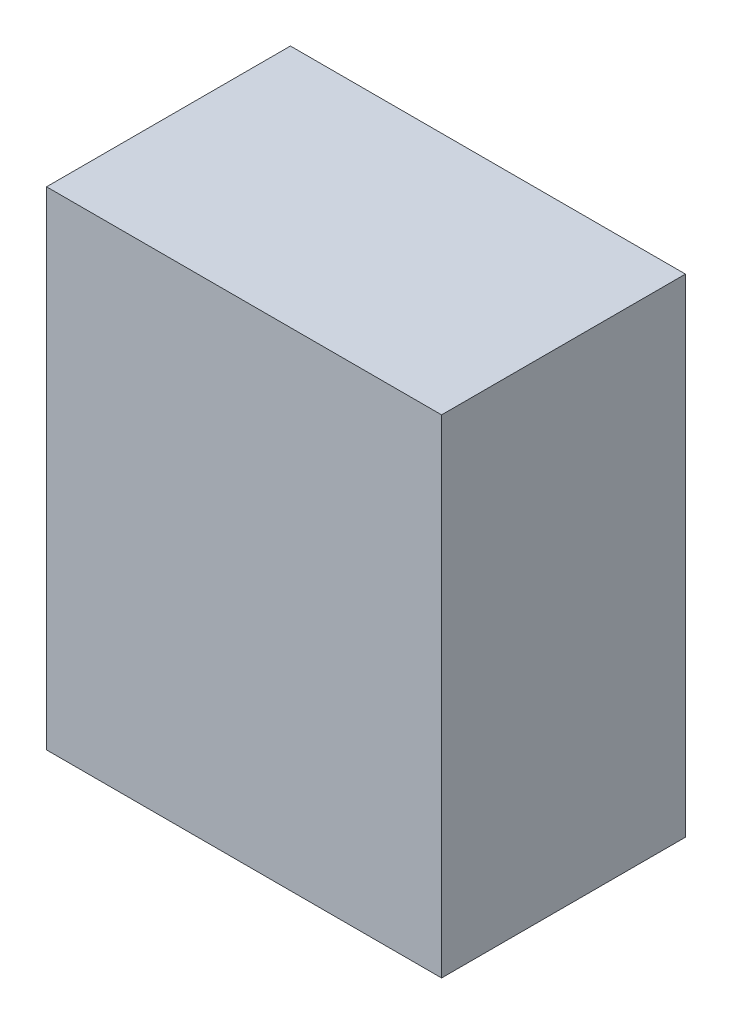
ISO-10303-21;
HEADER;
FILE_DESCRIPTION(('STEP AP214'),'2;1');
FILE_NAME('part.step','',(''),(''),'','','');
FILE_SCHEMA(('AUTOMOTIVE_DESIGN { 1 0 10303 214 1 1 1 1 }'));
ENDSEC;
DATA;
#1=APPLICATION_CONTEXT('core data for automotive mechanical design processes');
#2=APPLICATION_PROTOCOL_DEFINITION('international standard','automotive_design',2000,#1);
#3=PRODUCT_CONTEXT('',#1,'mechanical');
#4=PRODUCT('Part','Part','',(#3));
#5=PRODUCT_RELATED_PRODUCT_CATEGORY('part','',(#4));
#6=PRODUCT_DEFINITION_FORMATION('','',#4);
#7=PRODUCT_DEFINITION_CONTEXT('part definition',#1,'design');
#8=PRODUCT_DEFINITION('design','',#6,#7);
#9=PRODUCT_DEFINITION_SHAPE('','',#8);
#10=(LENGTH_UNIT() NAMED_UNIT(*) SI_UNIT(.MILLI.,.METRE.));
#11=(NAMED_UNIT(*) PLANE_ANGLE_UNIT() SI_UNIT($,.RADIAN.));
#12=(NAMED_UNIT(*) SI_UNIT($,.STERADIAN.) SOLID_ANGLE_UNIT());
#13=UNCERTAINTY_MEASURE_WITH_UNIT(LENGTH_MEASURE(1.E-05),#10,'distance_accuracy_value','');
#14=(GEOMETRIC_REPRESENTATION_CONTEXT(3) GLOBAL_UNCERTAINTY_ASSIGNED_CONTEXT((#13)) GLOBAL_UNIT_ASSIGNED_CONTEXT((#10,
#11,#12)) REPRESENTATION_CONTEXT('',''));
#15=CARTESIAN_POINT('',(0.,0.,0.));
#16=DIRECTION('',(0.,0.,1.));
#17=DIRECTION('',(1.,0.,0.));
#18=AXIS2_PLACEMENT_3D('',#15,#16,#17);
#19=CARTESIAN_POINT('',(0.,0.,10.));
#20=DIRECTION('',(1.,0.,0.));
#21=DIRECTION('',(0.,0.,-1.));
#22=AXIS2_PLACEMENT_3D('',#19,#20,#21);
#23=PLANE('',#22);
#24=DIRECTION('',(0.,-1.,0.));
#25=VECTOR('',#24,1.);
#26=CARTESIAN_POINT('',(0.,0.,0.));
#27=LINE('',#26,#25);
#28=CARTESIAN_POINT('',(0.,20.,0.));
#29=VERTEX_POINT('',#28);
#30=CARTESIAN_POINT('',(0.,0.,0.));
#31=VERTEX_POINT('',#30);
#32=EDGE_CURVE('E106',#29,#31,#27,.T.);
#33=ORIENTED_EDGE('',*,*,#32,.T.);
#34=DIRECTION('',(0.,0.,-1.));
#35=VECTOR('',#34,1.);
#36=CARTESIAN_POINT('',(0.,0.,10.));
#37=LINE('',#36,#35);
#38=CARTESIAN_POINT('',(0.,0.,10.));
#39=VERTEX_POINT('',#38);
#40=EDGE_CURVE('E11',#39,#31,#37,.T.);
#41=ORIENTED_EDGE('',*,*,#40,.F.);
#42=DIRECTION('',(0.,-1.,0.));
#43=VECTOR('',#42,1.);
#44=CARTESIAN_POINT('',(0.,0.,10.));
#45=LINE('',#44,#43);
#46=CARTESIAN_POINT('',(0.,20.,10.));
#47=VERTEX_POINT('',#46);
#48=EDGE_CURVE('E92',#47,#39,#45,.T.);
#49=ORIENTED_EDGE('',*,*,#48,.F.);
#50=DIRECTION('',(0.,0.,-1.));
#51=VECTOR('',#50,1.);
#52=CARTESIAN_POINT('',(0.,20.,10.));
#53=LINE('',#52,#51);
#54=EDGE_CURVE('E105',#47,#29,#53,.T.);
#55=ORIENTED_EDGE('',*,*,#54,.T.);
#56=EDGE_LOOP('',(#33,#41,#49,#55));
#57=FACE_BOUND('',#56,.T.);
#58=ADVANCED_FACE('F43',(#57),#23,.F.);
#59=CARTESIAN_POINT('',(0.,0.,10.));
#60=DIRECTION('',(0.,1.,0.));
#61=DIRECTION('',(0.,0.,1.));
#62=AXIS2_PLACEMENT_3D('',#59,#60,#61);
#63=PLANE('',#62);
#64=DIRECTION('',(1.,0.,0.));
#65=VECTOR('',#64,1.);
#66=CARTESIAN_POINT('',(0.,0.,0.));
#67=LINE('',#66,#65);
#68=CARTESIAN_POINT('',(16.2,0.,0.));
#69=VERTEX_POINT('',#68);
#70=EDGE_CURVE('E97',#31,#69,#67,.T.);
#71=ORIENTED_EDGE('',*,*,#70,.T.);
#72=DIRECTION('',(0.,0.,-1.));
#73=VECTOR('',#72,1.);
#74=CARTESIAN_POINT('',(16.2,0.,10.));
#75=LINE('',#74,#73);
#76=CARTESIAN_POINT('',(16.2,0.,10.));
#77=VERTEX_POINT('',#76);
#78=EDGE_CURVE('E51',#77,#69,#75,.T.);
#79=ORIENTED_EDGE('',*,*,#78,.F.);
#80=DIRECTION('',(1.,0.,0.));
#81=VECTOR('',#80,1.);
#82=CARTESIAN_POINT('',(0.,0.,10.));
#83=LINE('',#82,#81);
#84=EDGE_CURVE('E87',#39,#77,#83,.T.);
#85=ORIENTED_EDGE('',*,*,#84,.F.);
#86=ORIENTED_EDGE('',*,*,#40,.T.);
#87=EDGE_LOOP('',(#71,#79,#85,#86));
#88=FACE_BOUND('',#87,.T.);
#89=ADVANCED_FACE('F100',(#88),#63,.F.);
#90=CARTESIAN_POINT('',(16.2,0.,10.));
#91=DIRECTION('',(-1.,0.,0.));
#92=DIRECTION('',(0.,0.,1.));
#93=AXIS2_PLACEMENT_3D('',#90,#91,#92);
#94=PLANE('',#93);
#95=DIRECTION('',(0.,1.,0.));
#96=VECTOR('',#95,1.);
#97=CARTESIAN_POINT('',(16.2,0.,0.));
#98=LINE('',#97,#96);
#99=CARTESIAN_POINT('',(16.2,20.,0.));
#100=VERTEX_POINT('',#99);
#101=EDGE_CURVE('E78',#69,#100,#98,.T.);
#102=ORIENTED_EDGE('',*,*,#101,.T.);
#103=DIRECTION('',(0.,0.,-1.));
#104=VECTOR('',#103,1.);
#105=CARTESIAN_POINT('',(16.2,20.,10.));
#106=LINE('',#105,#104);
#107=CARTESIAN_POINT('',(16.2,20.,10.));
#108=VERTEX_POINT('',#107);
#109=EDGE_CURVE('E98',#108,#100,#106,.T.);
#110=ORIENTED_EDGE('',*,*,#109,.F.);
#111=DIRECTION('',(0.,1.,0.));
#112=VECTOR('',#111,1.);
#113=CARTESIAN_POINT('',(16.2,0.,10.));
#114=LINE('',#113,#112);
#115=EDGE_CURVE('E95',#77,#108,#114,.T.);
#116=ORIENTED_EDGE('',*,*,#115,.F.);
#117=ORIENTED_EDGE('',*,*,#78,.T.);
#118=EDGE_LOOP('',(#102,#110,#116,#117));
#119=FACE_BOUND('',#118,.T.);
#120=ADVANCED_FACE('F99',(#119),#94,.F.);
#121=CARTESIAN_POINT('',(0.,20.,10.));
#122=DIRECTION('',(0.,-1.,0.));
#123=DIRECTION('',(0.,0.,-1.));
#124=AXIS2_PLACEMENT_3D('',#121,#122,#123);
#125=PLANE('',#124);
#126=DIRECTION('',(-1.,0.,0.));
#127=VECTOR('',#126,1.);
#128=CARTESIAN_POINT('',(0.,20.,0.));
#129=LINE('',#128,#127);
#130=EDGE_CURVE('E85',#100,#29,#129,.T.);
#131=ORIENTED_EDGE('',*,*,#130,.T.);
#132=ORIENTED_EDGE('',*,*,#54,.F.);
#133=DIRECTION('',(-1.,0.,0.));
#134=VECTOR('',#133,1.);
#135=CARTESIAN_POINT('',(0.,20.,10.));
#136=LINE('',#135,#134);
#137=EDGE_CURVE('E56',#108,#47,#136,.T.);
#138=ORIENTED_EDGE('',*,*,#137,.F.);
#139=ORIENTED_EDGE('',*,*,#109,.T.);
#140=EDGE_LOOP('',(#131,#132,#138,#139));
#141=FACE_BOUND('',#140,.T.);
#142=ADVANCED_FACE('F111',(#141),#125,.F.);
#143=CARTESIAN_POINT('',(0.,0.,10.));
#144=DIRECTION('',(0.,0.,-1.));
#145=DIRECTION('',(-1.,0.,0.));
#146=AXIS2_PLACEMENT_3D('',#143,#144,#145);
#147=PLANE('',#146);
#148=ORIENTED_EDGE('',*,*,#48,.T.);
#149=ORIENTED_EDGE('',*,*,#84,.T.);
#150=ORIENTED_EDGE('',*,*,#115,.T.);
#151=ORIENTED_EDGE('',*,*,#137,.T.);
#152=EDGE_LOOP('',(#148,#149,#150,#151));
#153=FACE_BOUND('',#152,.T.);
#154=ADVANCED_FACE('F89',(#153),#147,.F.);
#155=CARTESIAN_POINT('',(0.,0.,0.));
#156=DIRECTION('',(0.,0.,-1.));
#157=DIRECTION('',(-1.,0.,0.));
#158=AXIS2_PLACEMENT_3D('',#155,#156,#157);
#159=PLANE('',#158);
#160=ORIENTED_EDGE('',*,*,#32,.F.);
#161=ORIENTED_EDGE('',*,*,#130,.F.);
#162=ORIENTED_EDGE('',*,*,#101,.F.);
#163=ORIENTED_EDGE('',*,*,#70,.F.);
#164=EDGE_LOOP('',(#160,#161,#162,#163));
#165=FACE_BOUND('',#164,.T.);
#166=ADVANCED_FACE('F116',(#165),#159,.T.);
#167=CLOSED_SHELL('',(#58,#89,#120,#142,#154,#166));
#168=MANIFOLD_SOLID_BREP('B2',#167);
#169=ADVANCED_BREP_SHAPE_REPRESENTATION('',(#18,#168),#14);
#170=SHAPE_DEFINITION_REPRESENTATION(#9,#169);
ENDSEC;
END-ISO-10303-21;
